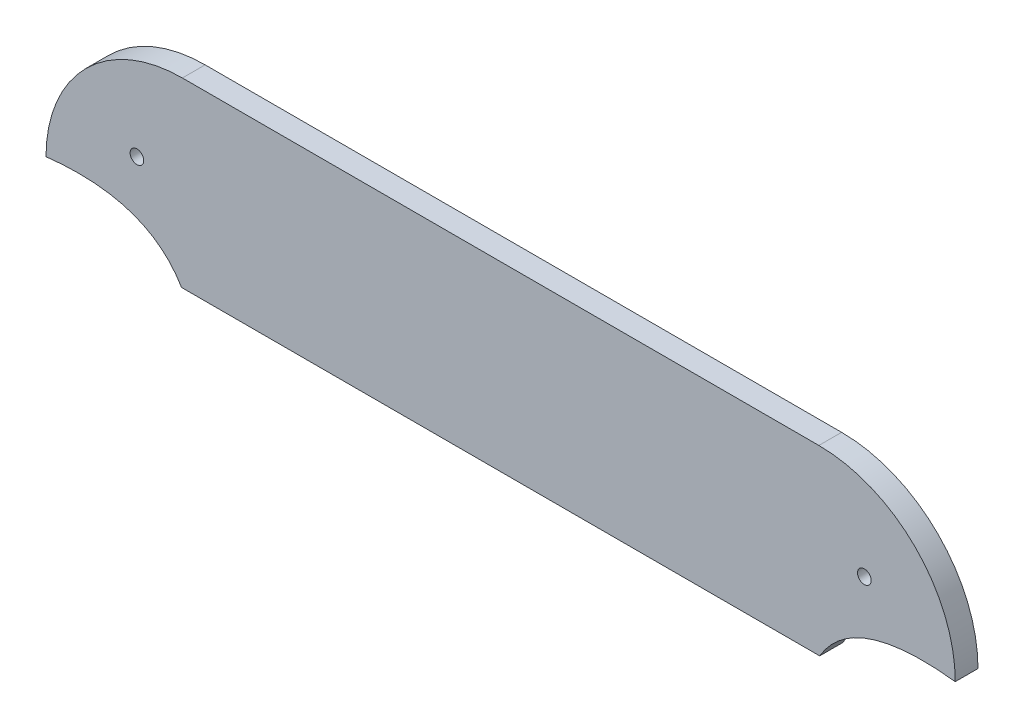
ISO-10303-21;
HEADER;
FILE_DESCRIPTION(('STEP AP214'),'2;1');
FILE_NAME('part.step','',(''),(''),'','','');
FILE_SCHEMA(('AUTOMOTIVE_DESIGN { 1 0 10303 214 1 1 1 1 }'));
ENDSEC;
DATA;
#1=APPLICATION_CONTEXT('core data for automotive mechanical design processes');
#2=APPLICATION_PROTOCOL_DEFINITION('international standard','automotive_design',2000,#1);
#3=PRODUCT_CONTEXT('',#1,'mechanical');
#4=PRODUCT('Part','Part','',(#3));
#5=PRODUCT_RELATED_PRODUCT_CATEGORY('part','',(#4));
#6=PRODUCT_DEFINITION_FORMATION('','',#4);
#7=PRODUCT_DEFINITION_CONTEXT('part definition',#1,'design');
#8=PRODUCT_DEFINITION('design','',#6,#7);
#9=PRODUCT_DEFINITION_SHAPE('','',#8);
#10=(LENGTH_UNIT() NAMED_UNIT(*) SI_UNIT(.MILLI.,.METRE.));
#11=(NAMED_UNIT(*) PLANE_ANGLE_UNIT() SI_UNIT($,.RADIAN.));
#12=(NAMED_UNIT(*) SI_UNIT($,.STERADIAN.) SOLID_ANGLE_UNIT());
#13=UNCERTAINTY_MEASURE_WITH_UNIT(LENGTH_MEASURE(1.E-05),#10,'distance_accuracy_value','');
#14=(GEOMETRIC_REPRESENTATION_CONTEXT(3) GLOBAL_UNCERTAINTY_ASSIGNED_CONTEXT((#13)) GLOBAL_UNIT_ASSIGNED_CONTEXT((#10,
#11,#12)) REPRESENTATION_CONTEXT('',''));
#15=CARTESIAN_POINT('',(0.,0.,0.));
#16=DIRECTION('',(0.,0.,1.));
#17=DIRECTION('',(1.,0.,0.));
#18=AXIS2_PLACEMENT_3D('',#15,#16,#17);
#19=CARTESIAN_POINT('',(70.,70.,5.));
#20=DIRECTION('',(0.,0.,-1.));
#21=DIRECTION('',(-1.,0.,0.));
#22=AXIS2_PLACEMENT_3D('',#19,#20,#21);
#23=CYLINDRICAL_SURFACE('',#22,30.);
#24=CARTESIAN_POINT('',(70.,70.,0.));
#25=DIRECTION('',(0.,0.,1.));
#26=DIRECTION('',(-1.,0.,0.));
#27=AXIS2_PLACEMENT_3D('',#24,#25,#26);
#28=CIRCLE('',#27,30.);
#29=CARTESIAN_POINT('',(100.,69.9999999999998,0.));
#30=VERTEX_POINT('',#29);
#31=CARTESIAN_POINT('',(69.9999999999998,100.,0.));
#32=VERTEX_POINT('',#31);
#33=EDGE_CURVE('E79',#30,#32,#28,.T.);
#34=ORIENTED_EDGE('',*,*,#33,.T.);
#35=DIRECTION('',(0.,0.,-1.));
#36=VECTOR('',#35,1.);
#37=CARTESIAN_POINT('',(69.9999999999998,100.,5.));
#38=LINE('',#37,#36);
#39=CARTESIAN_POINT('',(69.9999999999998,100.,5.));
#40=VERTEX_POINT('',#39);
#41=EDGE_CURVE('E74',#40,#32,#38,.T.);
#42=ORIENTED_EDGE('',*,*,#41,.F.);
#43=CARTESIAN_POINT('',(70.,70.,5.));
#44=DIRECTION('',(0.,0.,1.));
#45=DIRECTION('',(-1.,0.,0.));
#46=AXIS2_PLACEMENT_3D('',#43,#44,#45);
#47=CIRCLE('',#46,30.);
#48=CARTESIAN_POINT('',(100.,69.9999999999998,5.));
#49=VERTEX_POINT('',#48);
#50=EDGE_CURVE('E96',#49,#40,#47,.T.);
#51=ORIENTED_EDGE('',*,*,#50,.F.);
#52=DIRECTION('',(0.,0.,-1.));
#53=VECTOR('',#52,1.);
#54=CARTESIAN_POINT('',(100.,69.9999999999998,5.));
#55=LINE('',#54,#53);
#56=EDGE_CURVE('E40',#49,#30,#55,.T.);
#57=ORIENTED_EDGE('',*,*,#56,.T.);
#58=EDGE_LOOP('',(#34,#42,#51,#57));
#59=FACE_BOUND('',#58,.T.);
#60=ADVANCED_FACE('F33',(#59),#23,.T.);
#61=CARTESIAN_POINT('',(-69.9999999999998,100.,5.));
#62=DIRECTION('',(0.,-1.,0.));
#63=DIRECTION('',(0.,0.,-1.));
#64=AXIS2_PLACEMENT_3D('',#61,#62,#63);
#65=PLANE('',#64);
#66=DIRECTION('',(-1.,0.,0.));
#67=VECTOR('',#66,1.);
#68=CARTESIAN_POINT('',(-69.9999999999998,100.,0.));
#69=LINE('',#68,#67);
#70=CARTESIAN_POINT('',(-69.9999999999998,100.,0.));
#71=VERTEX_POINT('',#70);
#72=EDGE_CURVE('E68',#32,#71,#69,.T.);
#73=ORIENTED_EDGE('',*,*,#72,.T.);
#74=DIRECTION('',(0.,0.,-1.));
#75=VECTOR('',#74,1.);
#76=CARTESIAN_POINT('',(-69.9999999999998,100.,5.));
#77=LINE('',#76,#75);
#78=CARTESIAN_POINT('',(-69.9999999999998,100.,5.));
#79=VERTEX_POINT('',#78);
#80=EDGE_CURVE('E71',#79,#71,#77,.T.);
#81=ORIENTED_EDGE('',*,*,#80,.F.);
#82=DIRECTION('',(-1.,0.,0.));
#83=VECTOR('',#82,1.);
#84=CARTESIAN_POINT('',(-69.9999999999998,100.,5.));
#85=LINE('',#84,#83);
#86=EDGE_CURVE('E55',#40,#79,#85,.T.);
#87=ORIENTED_EDGE('',*,*,#86,.F.);
#88=ORIENTED_EDGE('',*,*,#41,.T.);
#89=EDGE_LOOP('',(#73,#81,#87,#88));
#90=FACE_BOUND('',#89,.T.);
#91=ADVANCED_FACE('F70',(#90),#65,.F.);
#92=CARTESIAN_POINT('',(-70.,70.,5.));
#93=DIRECTION('',(0.,0.,-1.));
#94=DIRECTION('',(-1.,0.,0.));
#95=AXIS2_PLACEMENT_3D('',#92,#93,#94);
#96=CYLINDRICAL_SURFACE('',#95,30.);
#97=CARTESIAN_POINT('',(-70.,70.,0.));
#98=DIRECTION('',(0.,0.,1.));
#99=DIRECTION('',(-1.,0.,0.));
#100=AXIS2_PLACEMENT_3D('',#97,#98,#99);
#101=CIRCLE('',#100,30.);
#102=CARTESIAN_POINT('',(-100.,69.9999999999998,0.));
#103=VERTEX_POINT('',#102);
#104=EDGE_CURVE('E78',#71,#103,#101,.T.);
#105=ORIENTED_EDGE('',*,*,#104,.T.);
#106=DIRECTION('',(0.,0.,-1.));
#107=VECTOR('',#106,1.);
#108=CARTESIAN_POINT('',(-100.,69.9999999999998,5.));
#109=LINE('',#108,#107);
#110=CARTESIAN_POINT('',(-100.,69.9999999999998,5.));
#111=VERTEX_POINT('',#110);
#112=EDGE_CURVE('E87',#111,#103,#109,.T.);
#113=ORIENTED_EDGE('',*,*,#112,.F.);
#114=CARTESIAN_POINT('',(-70.,70.,5.));
#115=DIRECTION('',(0.,0.,1.));
#116=DIRECTION('',(-1.,0.,0.));
#117=AXIS2_PLACEMENT_3D('',#114,#115,#116);
#118=CIRCLE('',#117,30.);
#119=EDGE_CURVE('E86',#79,#111,#118,.T.);
#120=ORIENTED_EDGE('',*,*,#119,.F.);
#121=ORIENTED_EDGE('',*,*,#80,.T.);
#122=EDGE_LOOP('',(#105,#113,#120,#121));
#123=FACE_BOUND('',#122,.T.);
#124=ADVANCED_FACE('F83',(#123),#96,.T.);
#125=CARTESIAN_POINT('',(90.,-90.,5.));
#126=DIRECTION('',(0.,0.,1.));
#127=DIRECTION('',(1.,0.,0.));
#128=AXIS2_PLACEMENT_3D('',#125,#126,#127);
#129=PLANE('',#128);
#130=CARTESIAN_POINT('',(-80.,80.,5.));
#131=DIRECTION('',(0.,0.,1.));
#132=DIRECTION('',(1.,0.,0.));
#133=AXIS2_PLACEMENT_3D('',#130,#131,#132);
#134=CIRCLE('',#133,1.5);
#135=CARTESIAN_POINT('',(-78.5,80.,5.));
#136=VERTEX_POINT('',#135);
#137=EDGE_CURVE('E223',#136,#136,#134,.T.);
#138=ORIENTED_EDGE('',*,*,#137,.F.);
#139=EDGE_LOOP('',(#138));
#140=FACE_BOUND('',#139,.T.);
#141=CARTESIAN_POINT('',(80.,80.,5.));
#142=DIRECTION('',(0.,0.,1.));
#143=DIRECTION('',(1.,0.,0.));
#144=AXIS2_PLACEMENT_3D('',#141,#142,#143);
#145=CIRCLE('',#144,1.5);
#146=CARTESIAN_POINT('',(81.5,80.,5.));
#147=VERTEX_POINT('',#146);
#148=EDGE_CURVE('E228',#147,#147,#145,.T.);
#149=ORIENTED_EDGE('',*,*,#148,.F.);
#150=EDGE_LOOP('',(#149));
#151=FACE_BOUND('',#150,.T.);
#152=DIRECTION('',(-1.,0.,0.));
#153=VECTOR('',#152,1.);
#154=CARTESIAN_POINT('',(-70.1824268769671,60.0000000000129,5.));
#155=LINE('',#154,#153);
#156=CARTESIAN_POINT('',(70.1824268809436,59.9999999999996,5.));
#157=VERTEX_POINT('',#156);
#158=CARTESIAN_POINT('',(-70.1824268809515,60.0000000067381,5.));
#159=VERTEX_POINT('',#158);
#160=EDGE_CURVE('E47',#157,#159,#155,.T.);
#161=ORIENTED_EDGE('',*,*,#160,.F.);
#162=CARTESIAN_POINT('',(100.,69.9999999999998,5.));
#163=CARTESIAN_POINT('',(41.5627507887384,76.7696481561118,5.));
#164=CARTESIAN_POINT('',(85.,-20.,5.));
#165=B_SPLINE_CURVE_WITH_KNOTS('',2,(#162,#163,#164),.UNSPECIFIED.,.F.,.F.,(3,3),(0.,1.),.UNSPECIFIED.);
#166=EDGE_CURVE('E114',#49,#157,#165,.T.);
#167=ORIENTED_EDGE('',*,*,#166,.F.);
#168=ORIENTED_EDGE('',*,*,#50,.T.);
#169=ORIENTED_EDGE('',*,*,#86,.T.);
#170=ORIENTED_EDGE('',*,*,#119,.T.);
#171=CARTESIAN_POINT('',(-85.,-20.,5.));
#172=CARTESIAN_POINT('',(-41.5627507887384,76.7696481561117,5.));
#173=CARTESIAN_POINT('',(-100.,69.9999999999998,5.));
#174=B_SPLINE_CURVE_WITH_KNOTS('',2,(#171,#172,#173),.UNSPECIFIED.,.F.,.F.,(3,3),(0.,1.),.UNSPECIFIED.);
#175=EDGE_CURVE('E119',#159,#111,#174,.T.);
#176=ORIENTED_EDGE('',*,*,#175,.F.);
#177=EDGE_LOOP('',(#161,#167,#168,#169,#170,#176));
#178=FACE_BOUND('',#177,.T.);
#179=ADVANCED_FACE('F146',(#140,#151,#178),#129,.T.);
#180=CARTESIAN_POINT('',(90.,-90.,0.));
#181=DIRECTION('',(0.,0.,1.));
#182=DIRECTION('',(1.,0.,0.));
#183=AXIS2_PLACEMENT_3D('',#180,#181,#182);
#184=PLANE('',#183);
#185=CARTESIAN_POINT('',(-80.,80.,0.));
#186=DIRECTION('',(0.,0.,1.));
#187=DIRECTION('',(1.,0.,0.));
#188=AXIS2_PLACEMENT_3D('',#185,#186,#187);
#189=CIRCLE('',#188,1.5);
#190=CARTESIAN_POINT('',(-78.5,80.,0.));
#191=VERTEX_POINT('',#190);
#192=EDGE_CURVE('E220',#191,#191,#189,.T.);
#193=ORIENTED_EDGE('',*,*,#192,.T.);
#194=EDGE_LOOP('',(#193));
#195=FACE_BOUND('',#194,.T.);
#196=CARTESIAN_POINT('',(80.,80.,0.));
#197=DIRECTION('',(0.,0.,1.));
#198=DIRECTION('',(1.,0.,0.));
#199=AXIS2_PLACEMENT_3D('',#196,#197,#198);
#200=CIRCLE('',#199,1.5);
#201=CARTESIAN_POINT('',(81.5,80.,0.));
#202=VERTEX_POINT('',#201);
#203=EDGE_CURVE('E224',#202,#202,#200,.T.);
#204=ORIENTED_EDGE('',*,*,#203,.T.);
#205=EDGE_LOOP('',(#204));
#206=FACE_BOUND('',#205,.T.);
#207=CARTESIAN_POINT('',(100.,69.9999999999998,0.));
#208=CARTESIAN_POINT('',(41.5627507887384,76.7696481561118,0.));
#209=CARTESIAN_POINT('',(85.,-20.,0.));
#210=B_SPLINE_CURVE_WITH_KNOTS('',2,(#207,#208,#209),.UNSPECIFIED.,.F.,.F.,(3,3),(0.,1.),.UNSPECIFIED.);
#211=CARTESIAN_POINT('',(70.1824268809515,60.0000000000129,0.));
#212=VERTEX_POINT('',#211);
#213=EDGE_CURVE('E113',#30,#212,#210,.T.);
#214=ORIENTED_EDGE('',*,*,#213,.T.);
#215=DIRECTION('',(-1.,0.,0.));
#216=VECTOR('',#215,1.);
#217=CARTESIAN_POINT('',(-141.914902020631,60.0000000000129,0.));
#218=LINE('',#217,#216);
#219=CARTESIAN_POINT('',(-70.1824268809515,60.0000000000129,0.));
#220=VERTEX_POINT('',#219);
#221=EDGE_CURVE('E233',#212,#220,#218,.T.);
#222=ORIENTED_EDGE('',*,*,#221,.T.);
#223=CARTESIAN_POINT('',(-85.,-20.,0.));
#224=CARTESIAN_POINT('',(-41.5627507887384,76.7696481561117,0.));
#225=CARTESIAN_POINT('',(-100.,69.9999999999998,0.));
#226=B_SPLINE_CURVE_WITH_KNOTS('',2,(#223,#224,#225),.UNSPECIFIED.,.F.,.F.,(3,3),(0.,1.),.UNSPECIFIED.);
#227=EDGE_CURVE('E94',#220,#103,#226,.T.);
#228=ORIENTED_EDGE('',*,*,#227,.T.);
#229=ORIENTED_EDGE('',*,*,#104,.F.);
#230=ORIENTED_EDGE('',*,*,#72,.F.);
#231=ORIENTED_EDGE('',*,*,#33,.F.);
#232=EDGE_LOOP('',(#214,#222,#228,#229,#230,#231));
#233=FACE_BOUND('',#232,.T.);
#234=ADVANCED_FACE('F91',(#195,#206,#233),#184,.F.);
#235=DIRECTION('',(0.,0.,1.));
#236=VECTOR('',#235,1.);
#237=SURFACE_OF_LINEAR_EXTRUSION('',#210,#236);
#238=ORIENTED_EDGE('',*,*,#166,.T.);
#239=DIRECTION('',(0.,0.,1.));
#240=VECTOR('',#239,1.);
#241=CARTESIAN_POINT('',(70.1824268769711,59.9999999999996,0.));
#242=LINE('',#241,#240);
#243=EDGE_CURVE('E124',#157,#212,#242,.F.);
#244=ORIENTED_EDGE('',*,*,#243,.T.);
#245=ORIENTED_EDGE('',*,*,#213,.F.);
#246=ORIENTED_EDGE('',*,*,#56,.F.);
#247=EDGE_LOOP('',(#238,#244,#245,#246));
#248=FACE_BOUND('',#247,.T.);
#249=ADVANCED_FACE('F143',(#248),#237,.F.);
#250=DIRECTION('',(0.,0.,1.));
#251=VECTOR('',#250,1.);
#252=SURFACE_OF_LINEAR_EXTRUSION('',#226,#251);
#253=ORIENTED_EDGE('',*,*,#227,.F.);
#254=DIRECTION('',(0.,0.,1.));
#255=VECTOR('',#254,1.);
#256=CARTESIAN_POINT('',(-70.182426876979,60.0000000000129,0.));
#257=LINE('',#256,#255);
#258=EDGE_CURVE('E11',#220,#159,#257,.T.);
#259=ORIENTED_EDGE('',*,*,#258,.T.);
#260=ORIENTED_EDGE('',*,*,#175,.T.);
#261=ORIENTED_EDGE('',*,*,#112,.T.);
#262=EDGE_LOOP('',(#253,#259,#260,#261));
#263=FACE_BOUND('',#262,.T.);
#264=ADVANCED_FACE('F138',(#263),#252,.F.);
#265=CARTESIAN_POINT('',(-70.1824268769671,60.0000000000129,0.));
#266=DIRECTION('',(0.,1.,0.));
#267=DIRECTION('',(-1.,0.,0.));
#268=AXIS2_PLACEMENT_3D('',#265,#266,#267);
#269=PLANE('',#268);
#270=ORIENTED_EDGE('',*,*,#160,.T.);
#271=ORIENTED_EDGE('',*,*,#258,.F.);
#272=ORIENTED_EDGE('',*,*,#221,.F.);
#273=ORIENTED_EDGE('',*,*,#243,.F.);
#274=EDGE_LOOP('',(#270,#271,#272,#273));
#275=FACE_BOUND('',#274,.T.);
#276=ADVANCED_FACE('F142',(#275),#269,.F.);
#277=CARTESIAN_POINT('',(80.,80.,0.));
#278=DIRECTION('',(0.,0.,1.));
#279=DIRECTION('',(1.,0.,0.));
#280=AXIS2_PLACEMENT_3D('',#277,#278,#279);
#281=CYLINDRICAL_SURFACE('',#280,1.5);
#282=ORIENTED_EDGE('',*,*,#203,.F.);
#283=EDGE_LOOP('',(#282));
#284=FACE_BOUND('',#283,.T.);
#285=ORIENTED_EDGE('',*,*,#148,.T.);
#286=EDGE_LOOP('',(#285));
#287=FACE_BOUND('',#286,.T.);
#288=ADVANCED_FACE('F188',(#284,#287),#281,.F.);
#289=CARTESIAN_POINT('',(-80.,80.,0.));
#290=DIRECTION('',(0.,0.,1.));
#291=DIRECTION('',(1.,0.,0.));
#292=AXIS2_PLACEMENT_3D('',#289,#290,#291);
#293=CYLINDRICAL_SURFACE('',#292,1.5);
#294=ORIENTED_EDGE('',*,*,#192,.F.);
#295=EDGE_LOOP('',(#294));
#296=FACE_BOUND('',#295,.T.);
#297=ORIENTED_EDGE('',*,*,#137,.T.);
#298=EDGE_LOOP('',(#297));
#299=FACE_BOUND('',#298,.T.);
#300=ADVANCED_FACE('F203',(#296,#299),#293,.F.);
#301=CLOSED_SHELL('',(#60,#91,#124,#179,#234,#249,#264,#276,#288,#300));
#302=MANIFOLD_SOLID_BREP('B2',#301);
#303=ADVANCED_BREP_SHAPE_REPRESENTATION('',(#18,#302),#14);
#304=SHAPE_DEFINITION_REPRESENTATION(#9,#303);
ENDSEC;
END-ISO-10303-21;
